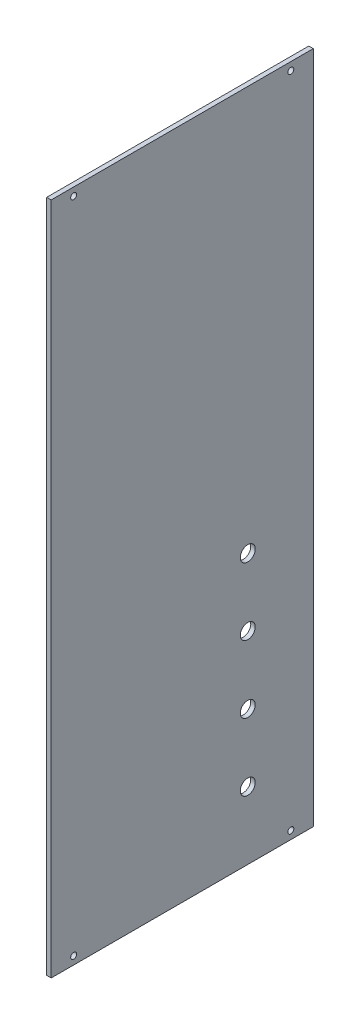
ISO-10303-21;
HEADER;
FILE_DESCRIPTION(('STEP AP214'),'2;1');
FILE_NAME('part.step','',(''),(''),'','','');
FILE_SCHEMA(('AUTOMOTIVE_DESIGN { 1 0 10303 214 1 1 1 1 }'));
ENDSEC;
DATA;
#1=APPLICATION_CONTEXT('core data for automotive mechanical design processes');
#2=APPLICATION_PROTOCOL_DEFINITION('international standard','automotive_design',2000,#1);
#3=PRODUCT_CONTEXT('',#1,'mechanical');
#4=PRODUCT('Part','Part','',(#3));
#5=PRODUCT_RELATED_PRODUCT_CATEGORY('part','',(#4));
#6=PRODUCT_DEFINITION_FORMATION('','',#4);
#7=PRODUCT_DEFINITION_CONTEXT('part definition',#1,'design');
#8=PRODUCT_DEFINITION('design','',#6,#7);
#9=PRODUCT_DEFINITION_SHAPE('','',#8);
#10=(LENGTH_UNIT() NAMED_UNIT(*) SI_UNIT(.MILLI.,.METRE.));
#11=(NAMED_UNIT(*) PLANE_ANGLE_UNIT() SI_UNIT($,.RADIAN.));
#12=(NAMED_UNIT(*) SI_UNIT($,.STERADIAN.) SOLID_ANGLE_UNIT());
#13=UNCERTAINTY_MEASURE_WITH_UNIT(LENGTH_MEASURE(1.E-05),#10,'distance_accuracy_value','');
#14=(GEOMETRIC_REPRESENTATION_CONTEXT(3) GLOBAL_UNCERTAINTY_ASSIGNED_CONTEXT((#13)) GLOBAL_UNIT_ASSIGNED_CONTEXT((#10,
#11,#12)) REPRESENTATION_CONTEXT('',''));
#15=CARTESIAN_POINT('',(0.,0.,0.));
#16=DIRECTION('',(0.,0.,1.));
#17=DIRECTION('',(1.,0.,0.));
#18=AXIS2_PLACEMENT_3D('',#15,#16,#17);
#19=CARTESIAN_POINT('',(3.,0.,0.));
#20=DIRECTION('',(1.,0.,0.));
#21=DIRECTION('',(0.,0.,-1.));
#22=AXIS2_PLACEMENT_3D('',#19,#20,#21);
#23=PLANE('',#22);
#24=CARTESIAN_POINT('',(3.,-180.,-43.75));
#25=DIRECTION('',(1.,0.,0.));
#26=DIRECTION('',(0.,0.,1.));
#27=AXIS2_PLACEMENT_3D('',#24,#25,#26);
#28=CIRCLE('',#27,5.);
#29=CARTESIAN_POINT('',(3.,-180.,-38.75));
#30=VERTEX_POINT('',#29);
#31=EDGE_CURVE('E145',#30,#30,#28,.T.);
#32=ORIENTED_EDGE('',*,*,#31,.F.);
#33=EDGE_LOOP('',(#32));
#34=FACE_BOUND('',#33,.T.);
#35=CARTESIAN_POINT('',(3.,-135.,-43.75));
#36=DIRECTION('',(1.,0.,0.));
#37=DIRECTION('',(0.,0.,1.));
#38=AXIS2_PLACEMENT_3D('',#35,#36,#37);
#39=CIRCLE('',#38,5.);
#40=CARTESIAN_POINT('',(3.,-135.,-38.75));
#41=VERTEX_POINT('',#40);
#42=EDGE_CURVE('E151',#41,#41,#39,.T.);
#43=ORIENTED_EDGE('',*,*,#42,.F.);
#44=EDGE_LOOP('',(#43));
#45=FACE_BOUND('',#44,.T.);
#46=CARTESIAN_POINT('',(3.,-45.,-43.75));
#47=DIRECTION('',(1.,0.,0.));
#48=DIRECTION('',(0.,0.,-1.));
#49=AXIS2_PLACEMENT_3D('',#46,#47,#48);
#50=CIRCLE('',#49,5.);
#51=CARTESIAN_POINT('',(3.,-45.,-48.75));
#52=VERTEX_POINT('',#51);
#53=EDGE_CURVE('E139',#52,#52,#50,.T.);
#54=ORIENTED_EDGE('',*,*,#53,.F.);
#55=EDGE_LOOP('',(#54));
#56=FACE_BOUND('',#55,.T.);
#57=CARTESIAN_POINT('',(3.,-90.,-43.75));
#58=DIRECTION('',(1.,0.,0.));
#59=DIRECTION('',(0.,0.,-1.));
#60=AXIS2_PLACEMENT_3D('',#57,#58,#59);
#61=CIRCLE('',#60,5.);
#62=CARTESIAN_POINT('',(3.,-90.,-48.75));
#63=VERTEX_POINT('',#62);
#64=EDGE_CURVE('E133',#63,#63,#61,.T.);
#65=ORIENTED_EDGE('',*,*,#64,.F.);
#66=EDGE_LOOP('',(#65));
#67=FACE_BOUND('',#66,.T.);
#68=CARTESIAN_POINT('',(3.,-219.668141089977,-72.5));
#69=DIRECTION('',(1.,0.,0.));
#70=DIRECTION('',(0.,0.,-1.));
#71=AXIS2_PLACEMENT_3D('',#68,#69,#70);
#72=CIRCLE('',#71,1.99999999999985);
#73=CARTESIAN_POINT('',(3.,-219.668141089977,-74.4999999999998));
#74=VERTEX_POINT('',#73);
#75=EDGE_CURVE('E121',#74,#74,#72,.T.);
#76=ORIENTED_EDGE('',*,*,#75,.F.);
#77=EDGE_LOOP('',(#76));
#78=FACE_BOUND('',#77,.T.);
#79=CARTESIAN_POINT('',(3.,219.668141089977,72.5));
#80=DIRECTION('',(1.,0.,0.));
#81=DIRECTION('',(0.,0.,-1.));
#82=AXIS2_PLACEMENT_3D('',#79,#80,#81);
#83=CIRCLE('',#82,2.);
#84=CARTESIAN_POINT('',(3.,219.668141089977,70.5));
#85=VERTEX_POINT('',#84);
#86=EDGE_CURVE('E100',#85,#85,#83,.T.);
#87=ORIENTED_EDGE('',*,*,#86,.F.);
#88=EDGE_LOOP('',(#87));
#89=FACE_BOUND('',#88,.T.);
#90=DIRECTION('',(0.,1.,0.));
#91=VECTOR('',#90,1.);
#92=CARTESIAN_POINT('',(3.,225.,-87.5));
#93=LINE('',#92,#91);
#94=CARTESIAN_POINT('',(3.,-225.,-87.5));
#95=VERTEX_POINT('',#94);
#96=CARTESIAN_POINT('',(3.,225.,-87.5));
#97=VERTEX_POINT('',#96);
#98=EDGE_CURVE('E85',#95,#97,#93,.T.);
#99=ORIENTED_EDGE('',*,*,#98,.T.);
#100=DIRECTION('',(0.,0.,1.));
#101=VECTOR('',#100,1.);
#102=CARTESIAN_POINT('',(3.,225.,87.5));
#103=LINE('',#102,#101);
#104=CARTESIAN_POINT('',(3.,225.,87.5));
#105=VERTEX_POINT('',#104);
#106=EDGE_CURVE('E80',#97,#105,#103,.T.);
#107=ORIENTED_EDGE('',*,*,#106,.T.);
#108=DIRECTION('',(0.,-1.,0.));
#109=VECTOR('',#108,1.);
#110=CARTESIAN_POINT('',(3.,225.,87.5));
#111=LINE('',#110,#109);
#112=CARTESIAN_POINT('',(3.,-225.,87.5));
#113=VERTEX_POINT('',#112);
#114=EDGE_CURVE('E83',#105,#113,#111,.T.);
#115=ORIENTED_EDGE('',*,*,#114,.T.);
#116=DIRECTION('',(0.,0.,-1.));
#117=VECTOR('',#116,1.);
#118=CARTESIAN_POINT('',(3.,-225.,87.5));
#119=LINE('',#118,#117);
#120=EDGE_CURVE('E50',#113,#95,#119,.T.);
#121=ORIENTED_EDGE('',*,*,#120,.T.);
#122=EDGE_LOOP('',(#99,#107,#115,#121));
#123=FACE_BOUND('',#122,.T.);
#124=CARTESIAN_POINT('',(3.,219.668141089977,-72.5));
#125=DIRECTION('',(1.,0.,0.));
#126=DIRECTION('',(0.,0.,-1.));
#127=AXIS2_PLACEMENT_3D('',#124,#125,#126);
#128=CIRCLE('',#127,1.99999999999985);
#129=CARTESIAN_POINT('',(3.,219.668141089977,-74.4999999999998));
#130=VERTEX_POINT('',#129);
#131=EDGE_CURVE('E115',#130,#130,#128,.T.);
#132=ORIENTED_EDGE('',*,*,#131,.F.);
#133=EDGE_LOOP('',(#132));
#134=FACE_BOUND('',#133,.T.);
#135=CARTESIAN_POINT('',(3.,-219.668141089977,72.5));
#136=DIRECTION('',(1.,0.,0.));
#137=DIRECTION('',(0.,0.,-1.));
#138=AXIS2_PLACEMENT_3D('',#135,#136,#137);
#139=CIRCLE('',#138,2.);
#140=CARTESIAN_POINT('',(3.,-219.668141089977,70.5));
#141=VERTEX_POINT('',#140);
#142=EDGE_CURVE('E127',#141,#141,#139,.T.);
#143=ORIENTED_EDGE('',*,*,#142,.F.);
#144=EDGE_LOOP('',(#143));
#145=FACE_BOUND('',#144,.T.);
#146=ADVANCED_FACE('F33',(#34,#45,#56,#67,#78,#89,#123,#134,#145),#23,.T.);
#147=CARTESIAN_POINT('',(0.,0.,0.));
#148=DIRECTION('',(1.,0.,0.));
#149=DIRECTION('',(0.,0.,-1.));
#150=AXIS2_PLACEMENT_3D('',#147,#148,#149);
#151=PLANE('',#150);
#152=CARTESIAN_POINT('',(0.,-180.,-43.75));
#153=DIRECTION('',(1.,0.,0.));
#154=DIRECTION('',(0.,0.,1.));
#155=AXIS2_PLACEMENT_3D('',#152,#153,#154);
#156=CIRCLE('',#155,5.);
#157=CARTESIAN_POINT('',(0.,-180.,-38.75));
#158=VERTEX_POINT('',#157);
#159=EDGE_CURVE('E142',#158,#158,#156,.T.);
#160=ORIENTED_EDGE('',*,*,#159,.T.);
#161=EDGE_LOOP('',(#160));
#162=FACE_BOUND('',#161,.T.);
#163=CARTESIAN_POINT('',(0.,-135.,-43.75));
#164=DIRECTION('',(1.,0.,0.));
#165=DIRECTION('',(0.,0.,1.));
#166=AXIS2_PLACEMENT_3D('',#163,#164,#165);
#167=CIRCLE('',#166,5.);
#168=CARTESIAN_POINT('',(0.,-135.,-38.75));
#169=VERTEX_POINT('',#168);
#170=EDGE_CURVE('E148',#169,#169,#167,.T.);
#171=ORIENTED_EDGE('',*,*,#170,.T.);
#172=EDGE_LOOP('',(#171));
#173=FACE_BOUND('',#172,.T.);
#174=CARTESIAN_POINT('',(0.,-45.,-43.75));
#175=DIRECTION('',(1.,0.,0.));
#176=DIRECTION('',(0.,0.,-1.));
#177=AXIS2_PLACEMENT_3D('',#174,#175,#176);
#178=CIRCLE('',#177,5.);
#179=CARTESIAN_POINT('',(0.,-45.,-48.75));
#180=VERTEX_POINT('',#179);
#181=EDGE_CURVE('E154',#180,#180,#178,.T.);
#182=ORIENTED_EDGE('',*,*,#181,.T.);
#183=EDGE_LOOP('',(#182));
#184=FACE_BOUND('',#183,.T.);
#185=CARTESIAN_POINT('',(0.,-90.,-43.75));
#186=DIRECTION('',(1.,0.,0.));
#187=DIRECTION('',(0.,0.,-1.));
#188=AXIS2_PLACEMENT_3D('',#185,#186,#187);
#189=CIRCLE('',#188,5.);
#190=CARTESIAN_POINT('',(0.,-90.,-48.75));
#191=VERTEX_POINT('',#190);
#192=EDGE_CURVE('E136',#191,#191,#189,.T.);
#193=ORIENTED_EDGE('',*,*,#192,.T.);
#194=EDGE_LOOP('',(#193));
#195=FACE_BOUND('',#194,.T.);
#196=DIRECTION('',(0.,1.,0.));
#197=VECTOR('',#196,1.);
#198=CARTESIAN_POINT('',(0.,225.,-87.5));
#199=LINE('',#198,#197);
#200=CARTESIAN_POINT('',(0.,-225.,-87.5));
#201=VERTEX_POINT('',#200);
#202=CARTESIAN_POINT('',(0.,225.,-87.5));
#203=VERTEX_POINT('',#202);
#204=EDGE_CURVE('E97',#201,#203,#199,.T.);
#205=ORIENTED_EDGE('',*,*,#204,.F.);
#206=DIRECTION('',(0.,0.,-1.));
#207=VECTOR('',#206,1.);
#208=CARTESIAN_POINT('',(0.,-225.,87.5));
#209=LINE('',#208,#207);
#210=CARTESIAN_POINT('',(0.,-225.,87.5));
#211=VERTEX_POINT('',#210);
#212=EDGE_CURVE('E73',#211,#201,#209,.T.);
#213=ORIENTED_EDGE('',*,*,#212,.F.);
#214=DIRECTION('',(0.,-1.,0.));
#215=VECTOR('',#214,1.);
#216=CARTESIAN_POINT('',(0.,225.,87.5));
#217=LINE('',#216,#215);
#218=CARTESIAN_POINT('',(0.,225.,87.5));
#219=VERTEX_POINT('',#218);
#220=EDGE_CURVE('E67',#219,#211,#217,.T.);
#221=ORIENTED_EDGE('',*,*,#220,.F.);
#222=DIRECTION('',(0.,0.,1.));
#223=VECTOR('',#222,1.);
#224=CARTESIAN_POINT('',(0.,225.,87.5));
#225=LINE('',#224,#223);
#226=EDGE_CURVE('E89',#203,#219,#225,.T.);
#227=ORIENTED_EDGE('',*,*,#226,.F.);
#228=EDGE_LOOP('',(#205,#213,#221,#227));
#229=FACE_BOUND('',#228,.T.);
#230=CARTESIAN_POINT('',(0.,219.668141089977,72.5));
#231=DIRECTION('',(1.,0.,0.));
#232=DIRECTION('',(0.,0.,-1.));
#233=AXIS2_PLACEMENT_3D('',#230,#231,#232);
#234=CIRCLE('',#233,2.);
#235=CARTESIAN_POINT('',(0.,219.668141089977,70.5));
#236=VERTEX_POINT('',#235);
#237=EDGE_CURVE('E112',#236,#236,#234,.T.);
#238=ORIENTED_EDGE('',*,*,#237,.T.);
#239=EDGE_LOOP('',(#238));
#240=FACE_BOUND('',#239,.T.);
#241=CARTESIAN_POINT('',(0.,219.668141089977,-72.5));
#242=DIRECTION('',(1.,0.,0.));
#243=DIRECTION('',(0.,0.,-1.));
#244=AXIS2_PLACEMENT_3D('',#241,#242,#243);
#245=CIRCLE('',#244,1.99999999999985);
#246=CARTESIAN_POINT('',(0.,219.668141089977,-74.4999999999998));
#247=VERTEX_POINT('',#246);
#248=EDGE_CURVE('E118',#247,#247,#245,.T.);
#249=ORIENTED_EDGE('',*,*,#248,.T.);
#250=EDGE_LOOP('',(#249));
#251=FACE_BOUND('',#250,.T.);
#252=CARTESIAN_POINT('',(0.,-219.668141089977,-72.5));
#253=DIRECTION('',(1.,0.,0.));
#254=DIRECTION('',(0.,0.,-1.));
#255=AXIS2_PLACEMENT_3D('',#252,#253,#254);
#256=CIRCLE('',#255,1.99999999999985);
#257=CARTESIAN_POINT('',(0.,-219.668141089977,-74.4999999999998));
#258=VERTEX_POINT('',#257);
#259=EDGE_CURVE('E124',#258,#258,#256,.T.);
#260=ORIENTED_EDGE('',*,*,#259,.T.);
#261=EDGE_LOOP('',(#260));
#262=FACE_BOUND('',#261,.T.);
#263=CARTESIAN_POINT('',(0.,-219.668141089977,72.5));
#264=DIRECTION('',(1.,0.,0.));
#265=DIRECTION('',(0.,0.,-1.));
#266=AXIS2_PLACEMENT_3D('',#263,#264,#265);
#267=CIRCLE('',#266,2.);
#268=CARTESIAN_POINT('',(0.,-219.668141089977,70.5));
#269=VERTEX_POINT('',#268);
#270=EDGE_CURVE('E130',#269,#269,#267,.T.);
#271=ORIENTED_EDGE('',*,*,#270,.T.);
#272=EDGE_LOOP('',(#271));
#273=FACE_BOUND('',#272,.T.);
#274=ADVANCED_FACE('F108',(#162,#173,#184,#195,#229,#240,#251,#262,#273),#151,.F.);
#275=CARTESIAN_POINT('',(3.,225.,-87.5));
#276=DIRECTION('',(0.,0.,1.));
#277=DIRECTION('',(1.,0.,0.));
#278=AXIS2_PLACEMENT_3D('',#275,#276,#277);
#279=PLANE('',#278);
#280=ORIENTED_EDGE('',*,*,#204,.T.);
#281=DIRECTION('',(-1.,0.,0.));
#282=VECTOR('',#281,1.);
#283=CARTESIAN_POINT('',(3.,225.,-87.5));
#284=LINE('',#283,#282);
#285=EDGE_CURVE('E11',#97,#203,#284,.T.);
#286=ORIENTED_EDGE('',*,*,#285,.F.);
#287=ORIENTED_EDGE('',*,*,#98,.F.);
#288=DIRECTION('',(-1.,0.,0.));
#289=VECTOR('',#288,1.);
#290=CARTESIAN_POINT('',(3.,-225.,-87.5));
#291=LINE('',#290,#289);
#292=EDGE_CURVE('E93',#95,#201,#291,.T.);
#293=ORIENTED_EDGE('',*,*,#292,.T.);
#294=EDGE_LOOP('',(#280,#286,#287,#293));
#295=FACE_BOUND('',#294,.T.);
#296=ADVANCED_FACE('F35',(#295),#279,.F.);
#297=CARTESIAN_POINT('',(3.,225.,87.5));
#298=DIRECTION('',(0.,-1.,0.));
#299=DIRECTION('',(0.,0.,-1.));
#300=AXIS2_PLACEMENT_3D('',#297,#298,#299);
#301=PLANE('',#300);
#302=ORIENTED_EDGE('',*,*,#226,.T.);
#303=DIRECTION('',(-1.,0.,0.));
#304=VECTOR('',#303,1.);
#305=CARTESIAN_POINT('',(3.,225.,87.5));
#306=LINE('',#305,#304);
#307=EDGE_CURVE('E42',#105,#219,#306,.T.);
#308=ORIENTED_EDGE('',*,*,#307,.F.);
#309=ORIENTED_EDGE('',*,*,#106,.F.);
#310=ORIENTED_EDGE('',*,*,#285,.T.);
#311=EDGE_LOOP('',(#302,#308,#309,#310));
#312=FACE_BOUND('',#311,.T.);
#313=ADVANCED_FACE('F88',(#312),#301,.F.);
#314=CARTESIAN_POINT('',(3.,225.,87.5));
#315=DIRECTION('',(0.,0.,-1.));
#316=DIRECTION('',(-1.,0.,0.));
#317=AXIS2_PLACEMENT_3D('',#314,#315,#316);
#318=PLANE('',#317);
#319=ORIENTED_EDGE('',*,*,#220,.T.);
#320=DIRECTION('',(-1.,0.,0.));
#321=VECTOR('',#320,1.);
#322=CARTESIAN_POINT('',(3.,-225.,87.5));
#323=LINE('',#322,#321);
#324=EDGE_CURVE('E90',#113,#211,#323,.T.);
#325=ORIENTED_EDGE('',*,*,#324,.F.);
#326=ORIENTED_EDGE('',*,*,#114,.F.);
#327=ORIENTED_EDGE('',*,*,#307,.T.);
#328=EDGE_LOOP('',(#319,#325,#326,#327));
#329=FACE_BOUND('',#328,.T.);
#330=ADVANCED_FACE('F91',(#329),#318,.F.);
#331=CARTESIAN_POINT('',(3.,-225.,87.5));
#332=DIRECTION('',(0.,1.,0.));
#333=DIRECTION('',(0.,0.,1.));
#334=AXIS2_PLACEMENT_3D('',#331,#332,#333);
#335=PLANE('',#334);
#336=ORIENTED_EDGE('',*,*,#212,.T.);
#337=ORIENTED_EDGE('',*,*,#292,.F.);
#338=ORIENTED_EDGE('',*,*,#120,.F.);
#339=ORIENTED_EDGE('',*,*,#324,.T.);
#340=EDGE_LOOP('',(#336,#337,#338,#339));
#341=FACE_BOUND('',#340,.T.);
#342=ADVANCED_FACE('F105',(#341),#335,.F.);
#343=CARTESIAN_POINT('',(3.,219.668141089977,72.5));
#344=DIRECTION('',(-1.,0.,0.));
#345=DIRECTION('',(0.,0.,1.));
#346=AXIS2_PLACEMENT_3D('',#343,#344,#345);
#347=CYLINDRICAL_SURFACE('',#346,2.);
#348=ORIENTED_EDGE('',*,*,#86,.T.);
#349=EDGE_LOOP('',(#348));
#350=FACE_BOUND('',#349,.T.);
#351=ORIENTED_EDGE('',*,*,#237,.F.);
#352=EDGE_LOOP('',(#351));
#353=FACE_BOUND('',#352,.T.);
#354=ADVANCED_FACE('F173',(#350,#353),#347,.F.);
#355=CARTESIAN_POINT('',(3.,219.668141089977,-72.5));
#356=DIRECTION('',(-1.,0.,0.));
#357=DIRECTION('',(0.,0.,1.));
#358=AXIS2_PLACEMENT_3D('',#355,#356,#357);
#359=CYLINDRICAL_SURFACE('',#358,1.99999999999985);
#360=ORIENTED_EDGE('',*,*,#131,.T.);
#361=EDGE_LOOP('',(#360));
#362=FACE_BOUND('',#361,.T.);
#363=ORIENTED_EDGE('',*,*,#248,.F.);
#364=EDGE_LOOP('',(#363));
#365=FACE_BOUND('',#364,.T.);
#366=ADVANCED_FACE('F176',(#362,#365),#359,.F.);
#367=CARTESIAN_POINT('',(3.,-219.668141089977,-72.5));
#368=DIRECTION('',(-1.,0.,0.));
#369=DIRECTION('',(0.,0.,1.));
#370=AXIS2_PLACEMENT_3D('',#367,#368,#369);
#371=CYLINDRICAL_SURFACE('',#370,1.99999999999985);
#372=ORIENTED_EDGE('',*,*,#75,.T.);
#373=EDGE_LOOP('',(#372));
#374=FACE_BOUND('',#373,.T.);
#375=ORIENTED_EDGE('',*,*,#259,.F.);
#376=EDGE_LOOP('',(#375));
#377=FACE_BOUND('',#376,.T.);
#378=ADVANCED_FACE('F192',(#374,#377),#371,.F.);
#379=CARTESIAN_POINT('',(3.,-219.668141089977,72.5));
#380=DIRECTION('',(-1.,0.,0.));
#381=DIRECTION('',(0.,0.,1.));
#382=AXIS2_PLACEMENT_3D('',#379,#380,#381);
#383=CYLINDRICAL_SURFACE('',#382,2.);
#384=ORIENTED_EDGE('',*,*,#142,.T.);
#385=EDGE_LOOP('',(#384));
#386=FACE_BOUND('',#385,.T.);
#387=ORIENTED_EDGE('',*,*,#270,.F.);
#388=EDGE_LOOP('',(#387));
#389=FACE_BOUND('',#388,.T.);
#390=ADVANCED_FACE('F189',(#386,#389),#383,.F.);
#391=CARTESIAN_POINT('',(3.,-90.,-43.75));
#392=DIRECTION('',(-1.,0.,0.));
#393=DIRECTION('',(0.,0.,1.));
#394=AXIS2_PLACEMENT_3D('',#391,#392,#393);
#395=CYLINDRICAL_SURFACE('',#394,5.);
#396=ORIENTED_EDGE('',*,*,#64,.T.);
#397=EDGE_LOOP('',(#396));
#398=FACE_BOUND('',#397,.T.);
#399=ORIENTED_EDGE('',*,*,#192,.F.);
#400=EDGE_LOOP('',(#399));
#401=FACE_BOUND('',#400,.T.);
#402=ADVANCED_FACE('F191',(#398,#401),#395,.F.);
#403=CARTESIAN_POINT('',(3.,-45.,-43.75));
#404=DIRECTION('',(-1.,0.,0.));
#405=DIRECTION('',(0.,0.,1.));
#406=AXIS2_PLACEMENT_3D('',#403,#404,#405);
#407=CYLINDRICAL_SURFACE('',#406,5.);
#408=ORIENTED_EDGE('',*,*,#53,.T.);
#409=EDGE_LOOP('',(#408));
#410=FACE_BOUND('',#409,.T.);
#411=ORIENTED_EDGE('',*,*,#181,.F.);
#412=EDGE_LOOP('',(#411));
#413=FACE_BOUND('',#412,.T.);
#414=ADVANCED_FACE('F160',(#410,#413),#407,.F.);
#415=CARTESIAN_POINT('',(3.,-135.,-43.75));
#416=DIRECTION('',(-1.,0.,0.));
#417=DIRECTION('',(0.,0.,1.));
#418=AXIS2_PLACEMENT_3D('',#415,#416,#417);
#419=CYLINDRICAL_SURFACE('',#418,5.);
#420=ORIENTED_EDGE('',*,*,#42,.T.);
#421=EDGE_LOOP('',(#420));
#422=FACE_BOUND('',#421,.T.);
#423=ORIENTED_EDGE('',*,*,#170,.F.);
#424=EDGE_LOOP('',(#423));
#425=FACE_BOUND('',#424,.T.);
#426=ADVANCED_FACE('F282',(#422,#425),#419,.F.);
#427=CARTESIAN_POINT('',(3.,-180.,-43.75));
#428=DIRECTION('',(-1.,0.,0.));
#429=DIRECTION('',(0.,0.,1.));
#430=AXIS2_PLACEMENT_3D('',#427,#428,#429);
#431=CYLINDRICAL_SURFACE('',#430,5.);
#432=ORIENTED_EDGE('',*,*,#31,.T.);
#433=EDGE_LOOP('',(#432));
#434=FACE_BOUND('',#433,.T.);
#435=ORIENTED_EDGE('',*,*,#159,.F.);
#436=EDGE_LOOP('',(#435));
#437=FACE_BOUND('',#436,.T.);
#438=ADVANCED_FACE('F290',(#434,#437),#431,.F.);
#439=CLOSED_SHELL('',(#146,#274,#296,#313,#330,#342,#354,#366,#378,#390,#402,#414,#426,#438));
#440=MANIFOLD_SOLID_BREP('B2',#439);
#441=ADVANCED_BREP_SHAPE_REPRESENTATION('',(#18,#440),#14);
#442=SHAPE_DEFINITION_REPRESENTATION(#9,#441);
ENDSEC;
END-ISO-10303-21;
